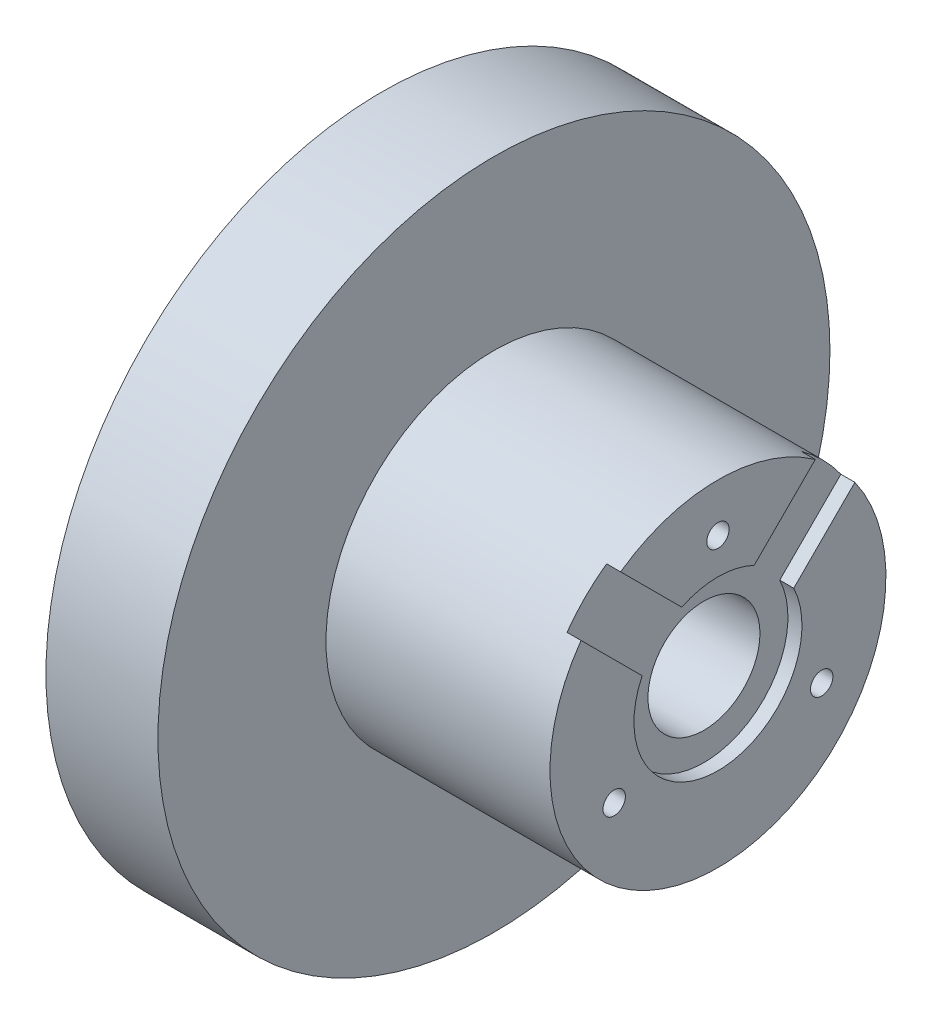
ISO-10303-21;
HEADER;
FILE_DESCRIPTION(('STEP AP214'),'2;1');
FILE_NAME('part.step','',(''),(''),'','','');
FILE_SCHEMA(('AUTOMOTIVE_DESIGN { 1 0 10303 214 1 1 1 1 }'));
ENDSEC;
DATA;
#1=APPLICATION_CONTEXT('core data for automotive mechanical design processes');
#2=APPLICATION_PROTOCOL_DEFINITION('international standard','automotive_design',2000,#1);
#3=PRODUCT_CONTEXT('',#1,'mechanical');
#4=PRODUCT('Part','Part','',(#3));
#5=PRODUCT_RELATED_PRODUCT_CATEGORY('part','',(#4));
#6=PRODUCT_DEFINITION_FORMATION('','',#4);
#7=PRODUCT_DEFINITION_CONTEXT('part definition',#1,'design');
#8=PRODUCT_DEFINITION('design','',#6,#7);
#9=PRODUCT_DEFINITION_SHAPE('','',#8);
#10=(LENGTH_UNIT() NAMED_UNIT(*) SI_UNIT(.MILLI.,.METRE.));
#11=(NAMED_UNIT(*) PLANE_ANGLE_UNIT() SI_UNIT($,.RADIAN.));
#12=(NAMED_UNIT(*) SI_UNIT($,.STERADIAN.) SOLID_ANGLE_UNIT());
#13=UNCERTAINTY_MEASURE_WITH_UNIT(LENGTH_MEASURE(1.E-05),#10,'distance_accuracy_value','');
#14=(GEOMETRIC_REPRESENTATION_CONTEXT(3) GLOBAL_UNCERTAINTY_ASSIGNED_CONTEXT((#13)) GLOBAL_UNIT_ASSIGNED_CONTEXT((#10,
#11,#12)) REPRESENTATION_CONTEXT('',''));
#15=CARTESIAN_POINT('',(0.,0.,0.));
#16=DIRECTION('',(0.,0.,1.));
#17=DIRECTION('',(1.,0.,0.));
#18=AXIS2_PLACEMENT_3D('',#15,#16,#17);
#19=CARTESIAN_POINT('',(38.1,0.,0.));
#20=DIRECTION('',(1.,0.,0.));
#21=DIRECTION('',(0.,0.,-1.));
#22=AXIS2_PLACEMENT_3D('',#19,#20,#21);
#23=PLANE('',#22);
#24=CARTESIAN_POINT('',(38.1,-6.79174116649496,-11.7636407722281));
#25=DIRECTION('',(1.,0.,0.));
#26=DIRECTION('',(0.,0.,-1.));
#27=AXIS2_PLACEMENT_3D('',#24,#25,#26);
#28=CIRCLE('',#27,1.27000000000075);
#29=CARTESIAN_POINT('',(38.1,-6.79174116649496,-13.0336407722289));
#30=VERTEX_POINT('',#29);
#31=EDGE_CURVE('E173',#30,#30,#28,.T.);
#32=ORIENTED_EDGE('',*,*,#31,.F.);
#33=EDGE_LOOP('',(#32));
#34=FACE_BOUND('',#33,.T.);
#35=CARTESIAN_POINT('',(38.1,-6.79174116649597,11.7636407722264));
#36=DIRECTION('',(1.,0.,0.));
#37=DIRECTION('',(0.,0.,-1.));
#38=AXIS2_PLACEMENT_3D('',#35,#36,#37);
#39=CIRCLE('',#38,1.2700000000011);
#40=CARTESIAN_POINT('',(38.1,-6.79174116649597,10.4936407722253));
#41=VERTEX_POINT('',#40);
#42=EDGE_CURVE('E162',#41,#41,#39,.T.);
#43=ORIENTED_EDGE('',*,*,#42,.F.);
#44=EDGE_LOOP('',(#43));
#45=FACE_BOUND('',#44,.T.);
#46=CARTESIAN_POINT('',(38.1,0.,0.));
#47=DIRECTION('',(1.,0.,0.));
#48=DIRECTION('',(0.,0.,-1.));
#49=AXIS2_PLACEMENT_3D('',#46,#47,#48);
#50=CIRCLE('',#49,19.05);
#51=CARTESIAN_POINT('',(38.1,11.0369138909612,15.5270419514957));
#52=VERTEX_POINT('',#51);
#53=CARTESIAN_POINT('',(38.1,11.0369138909619,-15.5270419514952));
#54=VERTEX_POINT('',#53);
#55=EDGE_CURVE('E183',#52,#54,#50,.T.);
#56=ORIENTED_EDGE('',*,*,#55,.T.);
#57=DIRECTION('',(0.,-0.707106781186582,0.707106781186513));
#58=VECTOR('',#57,1.);
#59=CARTESIAN_POINT('',(38.1,-2.24506403026718,-2.24506403026739));
#60=LINE('',#59,#58);
#61=CARTESIAN_POINT('',(38.1,4.10493596973314,-8.59506403026709));
#62=VERTEX_POINT('',#61);
#63=EDGE_CURVE('E143',#54,#62,#60,.T.);
#64=ORIENTED_EDGE('',*,*,#63,.T.);
#65=CARTESIAN_POINT('',(38.1,0.,0.));
#66=DIRECTION('',(1.,0.,0.));
#67=DIRECTION('',(0.,0.,-1.));
#68=AXIS2_PLACEMENT_3D('',#65,#66,#67);
#69=CIRCLE('',#68,9.525);
#70=CARTESIAN_POINT('',(38.1,4.10493596973271,8.59506403026729));
#71=VERTEX_POINT('',#70);
#72=EDGE_CURVE('E140',#71,#62,#69,.T.);
#73=ORIENTED_EDGE('',*,*,#72,.F.);
#74=DIRECTION('',(0.,-0.707106781186547,-0.707106781186548));
#75=VECTOR('',#74,1.);
#76=CARTESIAN_POINT('',(38.1,-2.24506403026729,2.24506403026728));
#77=LINE('',#76,#75);
#78=EDGE_CURVE('E138',#52,#71,#77,.T.);
#79=ORIENTED_EDGE('',*,*,#78,.F.);
#80=EDGE_LOOP('',(#56,#64,#73,#79));
#81=FACE_BOUND('',#80,.T.);
#82=ADVANCED_FACE('F33',(#34,#45,#81),#23,.T.);
#83=CARTESIAN_POINT('',(0.,0.,0.));
#84=DIRECTION('',(1.,0.,0.));
#85=DIRECTION('',(0.,0.,-1.));
#86=AXIS2_PLACEMENT_3D('',#83,#84,#85);
#87=CYLINDRICAL_SURFACE('',#86,6.35);
#88=CARTESIAN_POINT('',(0.,0.,0.));
#89=DIRECTION('',(1.,0.,0.));
#90=DIRECTION('',(0.,0.,-1.));
#91=AXIS2_PLACEMENT_3D('',#88,#89,#90);
#92=CIRCLE('',#91,6.35);
#93=CARTESIAN_POINT('',(0.,0.,-6.35));
#94=VERTEX_POINT('',#93);
#95=EDGE_CURVE('E166',#94,#94,#92,.T.);
#96=ORIENTED_EDGE('',*,*,#95,.F.);
#97=EDGE_LOOP('',(#96));
#98=FACE_BOUND('',#97,.T.);
#99=CARTESIAN_POINT('',(36.5125,0.,0.));
#100=DIRECTION('',(1.,0.,0.));
#101=DIRECTION('',(0.,0.,-1.));
#102=AXIS2_PLACEMENT_3D('',#99,#100,#101);
#103=CIRCLE('',#102,6.35);
#104=CARTESIAN_POINT('',(36.5125,0.,-6.35));
#105=VERTEX_POINT('',#104);
#106=EDGE_CURVE('E110',#105,#105,#103,.F.);
#107=ORIENTED_EDGE('',*,*,#106,.F.);
#108=EDGE_LOOP('',(#107));
#109=FACE_BOUND('',#108,.T.);
#110=ADVANCED_FACE('F229',(#98,#109),#87,.F.);
#111=CARTESIAN_POINT('',(12.7,0.,0.));
#112=DIRECTION('',(-1.,0.,0.));
#113=DIRECTION('',(0.,0.,1.));
#114=AXIS2_PLACEMENT_3D('',#111,#112,#113);
#115=CYLINDRICAL_SURFACE('',#114,38.1);
#116=CARTESIAN_POINT('',(12.7,0.,0.));
#117=DIRECTION('',(1.,0.,0.));
#118=DIRECTION('',(0.,0.,-1.));
#119=AXIS2_PLACEMENT_3D('',#116,#117,#118);
#120=CIRCLE('',#119,38.1);
#121=CARTESIAN_POINT('',(12.7,0.,-38.1));
#122=VERTEX_POINT('',#121);
#123=EDGE_CURVE('E42',#122,#122,#120,.T.);
#124=ORIENTED_EDGE('',*,*,#123,.F.);
#125=EDGE_LOOP('',(#124));
#126=FACE_BOUND('',#125,.T.);
#127=CARTESIAN_POINT('',(0.,0.,0.));
#128=DIRECTION('',(1.,0.,0.));
#129=DIRECTION('',(0.,0.,-1.));
#130=AXIS2_PLACEMENT_3D('',#127,#128,#129);
#131=CIRCLE('',#130,38.1);
#132=CARTESIAN_POINT('',(0.,0.,-38.1));
#133=VERTEX_POINT('',#132);
#134=EDGE_CURVE('E37',#133,#133,#131,.T.);
#135=ORIENTED_EDGE('',*,*,#134,.T.);
#136=EDGE_LOOP('',(#135));
#137=FACE_BOUND('',#136,.T.);
#138=ADVANCED_FACE('F35',(#126,#137),#115,.T.);
#139=CARTESIAN_POINT('',(12.7,0.,0.));
#140=DIRECTION('',(1.,0.,0.));
#141=DIRECTION('',(0.,0.,-1.));
#142=AXIS2_PLACEMENT_3D('',#139,#140,#141);
#143=PLANE('',#142);
#144=CARTESIAN_POINT('',(12.7,0.,0.));
#145=DIRECTION('',(1.,0.,0.));
#146=DIRECTION('',(0.,0.,-1.));
#147=AXIS2_PLACEMENT_3D('',#144,#145,#146);
#148=CIRCLE('',#147,19.05);
#149=CARTESIAN_POINT('',(12.7,0.,-19.05));
#150=VERTEX_POINT('',#149);
#151=EDGE_CURVE('E11',#150,#150,#148,.T.);
#152=ORIENTED_EDGE('',*,*,#151,.F.);
#153=EDGE_LOOP('',(#152));
#154=FACE_BOUND('',#153,.T.);
#155=ORIENTED_EDGE('',*,*,#123,.T.);
#156=EDGE_LOOP('',(#155));
#157=FACE_BOUND('',#156,.T.);
#158=ADVANCED_FACE('F253',(#154,#157),#143,.T.);
#159=CARTESIAN_POINT('',(0.,0.,0.));
#160=DIRECTION('',(1.,0.,0.));
#161=DIRECTION('',(0.,0.,-1.));
#162=AXIS2_PLACEMENT_3D('',#159,#160,#161);
#163=PLANE('',#162);
#164=ORIENTED_EDGE('',*,*,#95,.T.);
#165=EDGE_LOOP('',(#164));
#166=FACE_BOUND('',#165,.T.);
#167=ORIENTED_EDGE('',*,*,#134,.F.);
#168=EDGE_LOOP('',(#167));
#169=FACE_BOUND('',#168,.T.);
#170=ADVANCED_FACE('F249',(#166,#169),#163,.F.);
#171=CARTESIAN_POINT('',(38.1,0.,0.));
#172=DIRECTION('',(-1.,0.,0.));
#173=DIRECTION('',(0.,0.,1.));
#174=AXIS2_PLACEMENT_3D('',#171,#172,#173);
#175=CYLINDRICAL_SURFACE('',#174,19.05);
#176=CARTESIAN_POINT('',(38.1,15.5270419514963,-11.0369138909604));
#177=VERTEX_POINT('',#176);
#178=CARTESIAN_POINT('',(38.1,15.5270419514957,11.0369138909612));
#179=VERTEX_POINT('',#178);
#180=EDGE_CURVE('E185',#177,#179,#50,.T.);
#181=ORIENTED_EDGE('',*,*,#180,.F.);
#182=DIRECTION('',(-1.,0.,0.));
#183=VECTOR('',#182,1.);
#184=CARTESIAN_POINT('',(38.1,15.5270419514963,-11.0369138909604));
#185=LINE('',#184,#183);
#186=CARTESIAN_POINT('',(36.5125,15.5270419514963,-11.0369138909604));
#187=VERTEX_POINT('',#186);
#188=EDGE_CURVE('E160',#177,#187,#185,.T.);
#189=ORIENTED_EDGE('',*,*,#188,.T.);
#190=CARTESIAN_POINT('',(36.5125,0.,0.));
#191=DIRECTION('',(1.,0.,0.));
#192=DIRECTION('',(0.,0.,-1.));
#193=AXIS2_PLACEMENT_3D('',#190,#191,#192);
#194=CIRCLE('',#193,19.05);
#195=CARTESIAN_POINT('',(36.5125,11.0369138909619,-15.5270419514952));
#196=VERTEX_POINT('',#195);
#197=EDGE_CURVE('E107',#196,#187,#194,.T.);
#198=ORIENTED_EDGE('',*,*,#197,.F.);
#199=DIRECTION('',(-1.,0.,0.));
#200=VECTOR('',#199,1.);
#201=CARTESIAN_POINT('',(38.1,11.0369138909619,-15.5270419514952));
#202=LINE('',#201,#200);
#203=EDGE_CURVE('E158',#54,#196,#202,.T.);
#204=ORIENTED_EDGE('',*,*,#203,.F.);
#205=ORIENTED_EDGE('',*,*,#55,.F.);
#206=DIRECTION('',(-1.,0.,0.));
#207=VECTOR('',#206,1.);
#208=CARTESIAN_POINT('',(38.1,11.0369138909612,15.5270419514957));
#209=LINE('',#208,#207);
#210=CARTESIAN_POINT('',(36.5125,11.0369138909612,15.5270419514957));
#211=VERTEX_POINT('',#210);
#212=EDGE_CURVE('E155',#52,#211,#209,.T.);
#213=ORIENTED_EDGE('',*,*,#212,.T.);
#214=CARTESIAN_POINT('',(36.5125,15.5270419514957,11.0369138909612));
#215=VERTEX_POINT('',#214);
#216=EDGE_CURVE('E148',#215,#211,#194,.T.);
#217=ORIENTED_EDGE('',*,*,#216,.F.);
#218=DIRECTION('',(-1.,0.,0.));
#219=VECTOR('',#218,1.);
#220=CARTESIAN_POINT('',(38.1,15.5270419514957,11.0369138909612));
#221=LINE('',#220,#219);
#222=EDGE_CURVE('E58',#179,#215,#221,.T.);
#223=ORIENTED_EDGE('',*,*,#222,.F.);
#224=EDGE_LOOP('',(#181,#189,#198,#204,#205,#213,#217,#223));
#225=FACE_BOUND('',#224,.T.);
#226=ORIENTED_EDGE('',*,*,#151,.T.);
#227=EDGE_LOOP('',(#226));
#228=FACE_BOUND('',#227,.T.);
#229=ADVANCED_FACE('F198',(#225,#228),#175,.T.);
#230=DIRECTION('',(0.,-0.707106781186583,0.707106781186512));
#231=VECTOR('',#230,1.);
#232=CARTESIAN_POINT('',(38.1,2.24506403026717,2.24506403026739));
#233=LINE('',#232,#231);
#234=CARTESIAN_POINT('',(38.1,8.59506403026749,-4.10493596973229));
#235=VERTEX_POINT('',#234);
#236=EDGE_CURVE('E114',#177,#235,#233,.T.);
#237=ORIENTED_EDGE('',*,*,#236,.F.);
#238=ORIENTED_EDGE('',*,*,#180,.T.);
#239=DIRECTION('',(0.,-0.707106781186548,-0.707106781186548));
#240=VECTOR('',#239,1.);
#241=CARTESIAN_POINT('',(38.1,2.24506403026728,-2.24506403026728));
#242=LINE('',#241,#240);
#243=CARTESIAN_POINT('',(38.1,8.59506403026729,4.10493596973272));
#244=VERTEX_POINT('',#243);
#245=EDGE_CURVE('E135',#179,#244,#242,.T.);
#246=ORIENTED_EDGE('',*,*,#245,.T.);
#247=CARTESIAN_POINT('',(38.1,0.,0.));
#248=DIRECTION('',(1.,0.,0.));
#249=DIRECTION('',(0.,0.,-1.));
#250=AXIS2_PLACEMENT_3D('',#247,#248,#249);
#251=CIRCLE('',#250,9.525);
#252=EDGE_CURVE('E133',#235,#244,#251,.T.);
#253=ORIENTED_EDGE('',*,*,#252,.F.);
#254=EDGE_LOOP('',(#237,#238,#246,#253));
#255=FACE_BOUND('',#254,.T.);
#256=CARTESIAN_POINT('',(38.1,13.5834823329909,0.));
#257=DIRECTION('',(1.,0.,0.));
#258=DIRECTION('',(0.,0.,-1.));
#259=AXIS2_PLACEMENT_3D('',#256,#257,#258);
#260=CIRCLE('',#259,1.27);
#261=CARTESIAN_POINT('',(38.1,13.5834823329909,-1.27));
#262=VERTEX_POINT('',#261);
#263=EDGE_CURVE('E167',#262,#262,#260,.T.);
#264=ORIENTED_EDGE('',*,*,#263,.F.);
#265=EDGE_LOOP('',(#264));
#266=FACE_BOUND('',#265,.T.);
#267=ADVANCED_FACE('F195',(#255,#266),#23,.T.);
#268=CARTESIAN_POINT('',(31.75,-6.79174116649597,11.7636407722264));
#269=DIRECTION('',(1.,0.,0.));
#270=DIRECTION('',(0.,0.,-1.));
#271=AXIS2_PLACEMENT_3D('',#268,#269,#270);
#272=CYLINDRICAL_SURFACE('',#271,1.2700000000011);
#273=CARTESIAN_POINT('',(31.75,-6.79174116649597,11.7636407722264));
#274=DIRECTION('',(1.,0.,0.));
#275=DIRECTION('',(0.,0.,-1.));
#276=AXIS2_PLACEMENT_3D('',#273,#274,#275);
#277=CIRCLE('',#276,1.2700000000011);
#278=CARTESIAN_POINT('',(31.75,-6.79174116649597,10.4936407722253));
#279=VERTEX_POINT('',#278);
#280=EDGE_CURVE('E176',#279,#279,#277,.T.);
#281=ORIENTED_EDGE('',*,*,#280,.F.);
#282=EDGE_LOOP('',(#281));
#283=FACE_BOUND('',#282,.T.);
#284=ORIENTED_EDGE('',*,*,#42,.T.);
#285=EDGE_LOOP('',(#284));
#286=FACE_BOUND('',#285,.T.);
#287=ADVANCED_FACE('F241',(#283,#286),#272,.F.);
#288=CARTESIAN_POINT('',(31.75,-6.79174116649597,11.7636407722264));
#289=DIRECTION('',(1.,0.,0.));
#290=DIRECTION('',(0.,0.,-1.));
#291=AXIS2_PLACEMENT_3D('',#288,#289,#290);
#292=PLANE('',#291);
#293=ORIENTED_EDGE('',*,*,#280,.T.);
#294=EDGE_LOOP('',(#293));
#295=FACE_BOUND('',#294,.T.);
#296=ADVANCED_FACE('F246',(#295),#292,.T.);
#297=CARTESIAN_POINT('',(31.75,-6.79174116649496,-11.7636407722281));
#298=DIRECTION('',(1.,0.,0.));
#299=DIRECTION('',(0.,0.,-1.));
#300=AXIS2_PLACEMENT_3D('',#297,#298,#299);
#301=CYLINDRICAL_SURFACE('',#300,1.27000000000075);
#302=CARTESIAN_POINT('',(31.75,-6.79174116649496,-11.7636407722281));
#303=DIRECTION('',(1.,0.,0.));
#304=DIRECTION('',(0.,0.,-1.));
#305=AXIS2_PLACEMENT_3D('',#302,#303,#304);
#306=CIRCLE('',#305,1.27000000000075);
#307=CARTESIAN_POINT('',(31.75,-6.79174116649496,-13.0336407722289));
#308=VERTEX_POINT('',#307);
#309=EDGE_CURVE('E170',#308,#308,#306,.T.);
#310=ORIENTED_EDGE('',*,*,#309,.F.);
#311=EDGE_LOOP('',(#310));
#312=FACE_BOUND('',#311,.T.);
#313=ORIENTED_EDGE('',*,*,#31,.T.);
#314=EDGE_LOOP('',(#313));
#315=FACE_BOUND('',#314,.T.);
#316=ADVANCED_FACE('F347',(#312,#315),#301,.F.);
#317=CARTESIAN_POINT('',(31.75,-6.79174116649496,-11.7636407722281));
#318=DIRECTION('',(1.,0.,0.));
#319=DIRECTION('',(0.,0.,-1.));
#320=AXIS2_PLACEMENT_3D('',#317,#318,#319);
#321=PLANE('',#320);
#322=ORIENTED_EDGE('',*,*,#309,.T.);
#323=EDGE_LOOP('',(#322));
#324=FACE_BOUND('',#323,.T.);
#325=ADVANCED_FACE('F343',(#324),#321,.T.);
#326=CARTESIAN_POINT('',(31.75,13.5834823329909,0.));
#327=DIRECTION('',(1.,0.,0.));
#328=DIRECTION('',(0.,0.,-1.));
#329=AXIS2_PLACEMENT_3D('',#326,#327,#328);
#330=CYLINDRICAL_SURFACE('',#329,1.27);
#331=CARTESIAN_POINT('',(31.75,13.5834823329909,0.));
#332=DIRECTION('',(1.,0.,0.));
#333=DIRECTION('',(0.,0.,-1.));
#334=AXIS2_PLACEMENT_3D('',#331,#332,#333);
#335=CIRCLE('',#334,1.27);
#336=CARTESIAN_POINT('',(31.75,13.5834823329909,-1.27));
#337=VERTEX_POINT('',#336);
#338=EDGE_CURVE('E163',#337,#337,#335,.T.);
#339=ORIENTED_EDGE('',*,*,#338,.F.);
#340=EDGE_LOOP('',(#339));
#341=FACE_BOUND('',#340,.T.);
#342=ORIENTED_EDGE('',*,*,#263,.T.);
#343=EDGE_LOOP('',(#342));
#344=FACE_BOUND('',#343,.T.);
#345=ADVANCED_FACE('F339',(#341,#344),#330,.F.);
#346=CARTESIAN_POINT('',(31.75,13.5834823329909,0.));
#347=DIRECTION('',(1.,0.,0.));
#348=DIRECTION('',(0.,0.,-1.));
#349=AXIS2_PLACEMENT_3D('',#346,#347,#348);
#350=PLANE('',#349);
#351=ORIENTED_EDGE('',*,*,#338,.T.);
#352=EDGE_LOOP('',(#351));
#353=FACE_BOUND('',#352,.T.);
#354=ADVANCED_FACE('F224',(#353),#350,.T.);
#355=CARTESIAN_POINT('',(36.5125,2.24506403026717,2.24506403026739));
#356=DIRECTION('',(0.,0.707106781186512,0.707106781186583));
#357=DIRECTION('',(0.,-0.707106781186583,0.707106781186512));
#358=AXIS2_PLACEMENT_3D('',#355,#356,#357);
#359=PLANE('',#358);
#360=ORIENTED_EDGE('',*,*,#236,.T.);
#361=DIRECTION('',(1.,0.,0.));
#362=VECTOR('',#361,1.);
#363=CARTESIAN_POINT('',(36.5125,8.59506403026749,-4.10493596973229));
#364=LINE('',#363,#362);
#365=CARTESIAN_POINT('',(36.5125,8.59506403026749,-4.10493596973229));
#366=VERTEX_POINT('',#365);
#367=EDGE_CURVE('E50',#366,#235,#364,.T.);
#368=ORIENTED_EDGE('',*,*,#367,.F.);
#369=DIRECTION('',(0.,-0.707106781186583,0.707106781186512));
#370=VECTOR('',#369,1.);
#371=CARTESIAN_POINT('',(36.5125,2.24506403026717,2.24506403026739));
#372=LINE('',#371,#370);
#373=EDGE_CURVE('E102',#187,#366,#372,.T.);
#374=ORIENTED_EDGE('',*,*,#373,.F.);
#375=ORIENTED_EDGE('',*,*,#188,.F.);
#376=EDGE_LOOP('',(#360,#368,#374,#375));
#377=FACE_BOUND('',#376,.T.);
#378=ADVANCED_FACE('F112',(#377),#359,.F.);
#379=CARTESIAN_POINT('',(36.5125,-2.24506403026718,-2.24506403026739));
#380=DIRECTION('',(0.,0.707106781186513,0.707106781186582));
#381=DIRECTION('',(0.,-0.707106781186582,0.707106781186513));
#382=AXIS2_PLACEMENT_3D('',#379,#380,#381);
#383=PLANE('',#382);
#384=ORIENTED_EDGE('',*,*,#203,.T.);
#385=DIRECTION('',(0.,-0.707106781186582,0.707106781186513));
#386=VECTOR('',#385,1.);
#387=CARTESIAN_POINT('',(36.5125,-2.24506403026718,-2.24506403026739));
#388=LINE('',#387,#386);
#389=CARTESIAN_POINT('',(36.5125,4.10493596973314,-8.59506403026709));
#390=VERTEX_POINT('',#389);
#391=EDGE_CURVE('E117',#196,#390,#388,.T.);
#392=ORIENTED_EDGE('',*,*,#391,.T.);
#393=DIRECTION('',(1.,0.,0.));
#394=VECTOR('',#393,1.);
#395=CARTESIAN_POINT('',(36.5125,4.10493596973314,-8.59506403026709));
#396=LINE('',#395,#394);
#397=EDGE_CURVE('E146',#390,#62,#396,.T.);
#398=ORIENTED_EDGE('',*,*,#397,.T.);
#399=ORIENTED_EDGE('',*,*,#63,.F.);
#400=EDGE_LOOP('',(#384,#392,#398,#399));
#401=FACE_BOUND('',#400,.T.);
#402=ADVANCED_FACE('F215',(#401),#383,.T.);
#403=CARTESIAN_POINT('',(36.5125,-2.24506403026729,2.24506403026728));
#404=DIRECTION('',(0.,-0.707106781186548,0.707106781186547));
#405=DIRECTION('',(0.,-0.707106781186547,-0.707106781186548));
#406=AXIS2_PLACEMENT_3D('',#403,#404,#405);
#407=PLANE('',#406);
#408=ORIENTED_EDGE('',*,*,#78,.T.);
#409=DIRECTION('',(1.,0.,0.));
#410=VECTOR('',#409,1.);
#411=CARTESIAN_POINT('',(36.5125,4.10493596973271,8.59506403026729));
#412=LINE('',#411,#410);
#413=CARTESIAN_POINT('',(36.5125,4.10493596973271,8.59506403026729));
#414=VERTEX_POINT('',#413);
#415=EDGE_CURVE('E149',#414,#71,#412,.T.);
#416=ORIENTED_EDGE('',*,*,#415,.F.);
#417=DIRECTION('',(0.,-0.707106781186547,-0.707106781186548));
#418=VECTOR('',#417,1.);
#419=CARTESIAN_POINT('',(36.5125,-2.24506403026729,2.24506403026728));
#420=LINE('',#419,#418);
#421=EDGE_CURVE('E123',#211,#414,#420,.T.);
#422=ORIENTED_EDGE('',*,*,#421,.F.);
#423=ORIENTED_EDGE('',*,*,#212,.F.);
#424=EDGE_LOOP('',(#408,#416,#422,#423));
#425=FACE_BOUND('',#424,.T.);
#426=ADVANCED_FACE('F205',(#425),#407,.F.);
#427=CARTESIAN_POINT('',(36.5125,2.24506403026728,-2.24506403026728));
#428=DIRECTION('',(0.,-0.707106781186548,0.707106781186548));
#429=DIRECTION('',(0.,-0.707106781186548,-0.707106781186548));
#430=AXIS2_PLACEMENT_3D('',#427,#428,#429);
#431=PLANE('',#430);
#432=ORIENTED_EDGE('',*,*,#222,.T.);
#433=DIRECTION('',(0.,-0.707106781186548,-0.707106781186548));
#434=VECTOR('',#433,1.);
#435=CARTESIAN_POINT('',(36.5125,2.24506403026728,-2.24506403026728));
#436=LINE('',#435,#434);
#437=CARTESIAN_POINT('',(36.5125,8.59506403026729,4.10493596973272));
#438=VERTEX_POINT('',#437);
#439=EDGE_CURVE('E121',#215,#438,#436,.T.);
#440=ORIENTED_EDGE('',*,*,#439,.T.);
#441=DIRECTION('',(1.,0.,0.));
#442=VECTOR('',#441,1.);
#443=CARTESIAN_POINT('',(36.5125,8.59506403026729,4.10493596973272));
#444=LINE('',#443,#442);
#445=EDGE_CURVE('E116',#438,#244,#444,.T.);
#446=ORIENTED_EDGE('',*,*,#445,.T.);
#447=ORIENTED_EDGE('',*,*,#245,.F.);
#448=EDGE_LOOP('',(#432,#440,#446,#447));
#449=FACE_BOUND('',#448,.T.);
#450=ADVANCED_FACE('F222',(#449),#431,.T.);
#451=CARTESIAN_POINT('',(36.5125,0.,0.));
#452=DIRECTION('',(1.,0.,0.));
#453=DIRECTION('',(0.,0.,-1.));
#454=AXIS2_PLACEMENT_3D('',#451,#452,#453);
#455=PLANE('',#454);
#456=ORIENTED_EDGE('',*,*,#106,.T.);
#457=EDGE_LOOP('',(#456));
#458=FACE_BOUND('',#457,.T.);
#459=ORIENTED_EDGE('',*,*,#197,.T.);
#460=ORIENTED_EDGE('',*,*,#373,.T.);
#461=CARTESIAN_POINT('',(36.5125,0.,0.));
#462=DIRECTION('',(1.,0.,0.));
#463=DIRECTION('',(0.,0.,-1.));
#464=AXIS2_PLACEMENT_3D('',#461,#462,#463);
#465=CIRCLE('',#464,9.525);
#466=EDGE_CURVE('E104',#366,#438,#465,.T.);
#467=ORIENTED_EDGE('',*,*,#466,.T.);
#468=ORIENTED_EDGE('',*,*,#439,.F.);
#469=ORIENTED_EDGE('',*,*,#216,.T.);
#470=ORIENTED_EDGE('',*,*,#421,.T.);
#471=CARTESIAN_POINT('',(36.5125,0.,0.));
#472=DIRECTION('',(1.,0.,0.));
#473=DIRECTION('',(0.,0.,-1.));
#474=AXIS2_PLACEMENT_3D('',#471,#472,#473);
#475=CIRCLE('',#474,9.525);
#476=EDGE_CURVE('E128',#414,#390,#475,.T.);
#477=ORIENTED_EDGE('',*,*,#476,.T.);
#478=ORIENTED_EDGE('',*,*,#391,.F.);
#479=EDGE_LOOP('',(#459,#460,#467,#468,#469,#470,#477,#478));
#480=FACE_BOUND('',#479,.T.);
#481=ADVANCED_FACE('F103',(#458,#480),#455,.T.);
#482=CARTESIAN_POINT('',(36.5125,0.,0.));
#483=DIRECTION('',(1.,0.,0.));
#484=DIRECTION('',(0.,0.,-1.));
#485=AXIS2_PLACEMENT_3D('',#482,#483,#484);
#486=CYLINDRICAL_SURFACE('',#485,9.525);
#487=ORIENTED_EDGE('',*,*,#72,.T.);
#488=ORIENTED_EDGE('',*,*,#397,.F.);
#489=ORIENTED_EDGE('',*,*,#476,.F.);
#490=ORIENTED_EDGE('',*,*,#415,.T.);
#491=EDGE_LOOP('',(#487,#488,#489,#490));
#492=FACE_BOUND('',#491,.T.);
#493=ADVANCED_FACE('F211',(#492),#486,.F.);
#494=CARTESIAN_POINT('',(36.5125,0.,0.));
#495=DIRECTION('',(1.,0.,0.));
#496=DIRECTION('',(0.,0.,-1.));
#497=AXIS2_PLACEMENT_3D('',#494,#495,#496);
#498=CYLINDRICAL_SURFACE('',#497,9.525);
#499=ORIENTED_EDGE('',*,*,#252,.T.);
#500=ORIENTED_EDGE('',*,*,#445,.F.);
#501=ORIENTED_EDGE('',*,*,#466,.F.);
#502=ORIENTED_EDGE('',*,*,#367,.T.);
#503=EDGE_LOOP('',(#499,#500,#501,#502));
#504=FACE_BOUND('',#503,.T.);
#505=ADVANCED_FACE('F120',(#504),#498,.F.);
#506=CLOSED_SHELL('',(#82,#110,#138,#158,#170,#229,#267,#287,#296,#316,#325,#345,#354,#378,#402,
#426,#450,#481,#493,#505));
#507=MANIFOLD_SOLID_BREP('B2',#506);
#508=ADVANCED_BREP_SHAPE_REPRESENTATION('',(#18,#507),#14);
#509=SHAPE_DEFINITION_REPRESENTATION(#9,#508);
ENDSEC;
END-ISO-10303-21;
